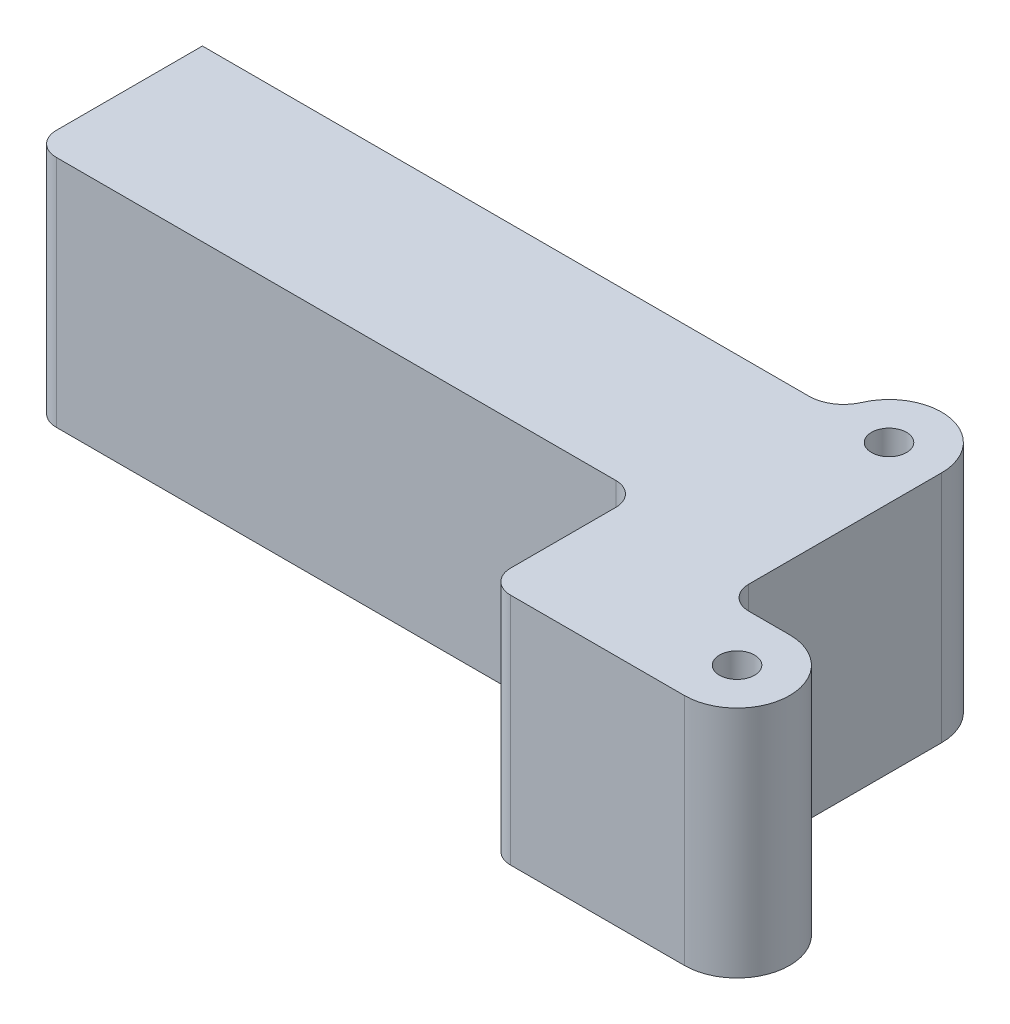
ISO-10303-21;
HEADER;
FILE_DESCRIPTION(('STEP AP214'),'2;1');
FILE_NAME('part.step','',(''),(''),'','','');
FILE_SCHEMA(('AUTOMOTIVE_DESIGN { 1 0 10303 214 1 1 1 1 }'));
ENDSEC;
DATA;
#1=APPLICATION_CONTEXT('core data for automotive mechanical design processes');
#2=APPLICATION_PROTOCOL_DEFINITION('international standard','automotive_design',2000,#1);
#3=PRODUCT_CONTEXT('',#1,'mechanical');
#4=PRODUCT('Part','Part','',(#3));
#5=PRODUCT_RELATED_PRODUCT_CATEGORY('part','',(#4));
#6=PRODUCT_DEFINITION_FORMATION('','',#4);
#7=PRODUCT_DEFINITION_CONTEXT('part definition',#1,'design');
#8=PRODUCT_DEFINITION('design','',#6,#7);
#9=PRODUCT_DEFINITION_SHAPE('','',#8);
#10=(LENGTH_UNIT() NAMED_UNIT(*) SI_UNIT(.MILLI.,.METRE.));
#11=(NAMED_UNIT(*) PLANE_ANGLE_UNIT() SI_UNIT($,.RADIAN.));
#12=(NAMED_UNIT(*) SI_UNIT($,.STERADIAN.) SOLID_ANGLE_UNIT());
#13=UNCERTAINTY_MEASURE_WITH_UNIT(LENGTH_MEASURE(1.E-05),#10,'distance_accuracy_value','');
#14=(GEOMETRIC_REPRESENTATION_CONTEXT(3) GLOBAL_UNCERTAINTY_ASSIGNED_CONTEXT((#13)) GLOBAL_UNIT_ASSIGNED_CONTEXT((#10,
#11,#12)) REPRESENTATION_CONTEXT('',''));
#15=CARTESIAN_POINT('',(0.,0.,0.));
#16=DIRECTION('',(0.,0.,1.));
#17=DIRECTION('',(1.,0.,0.));
#18=AXIS2_PLACEMENT_3D('',#15,#16,#17);
#19=CARTESIAN_POINT('',(-36.7213114754099,-12.2950819672131,5.));
#20=DIRECTION('',(0.,1.,0.));
#21=DIRECTION('',(0.,0.,1.));
#22=AXIS2_PLACEMENT_3D('',#19,#20,#21);
#23=PLANE('',#22);
#24=DIRECTION('',(0.,0.,-1.));
#25=VECTOR('',#24,1.);
#26=CARTESIAN_POINT('',(-29.9559446106797,-12.2950819672131,-0.980668059723612));
#27=LINE('',#26,#25);
#28=CARTESIAN_POINT('',(-29.9559446106797,-12.2950819672131,3.));
#29=VERTEX_POINT('',#28);
#30=CARTESIAN_POINT('',(-29.9559446106797,-12.2950819672131,-9.5));
#31=VERTEX_POINT('',#30);
#32=EDGE_CURVE('E261',#29,#31,#27,.T.);
#33=ORIENTED_EDGE('',*,*,#32,.T.);
#34=DIRECTION('',(-1.,0.,0.));
#35=VECTOR('',#34,1.);
#36=CARTESIAN_POINT('',(-29.9559446106797,-12.2950819672131,-9.5));
#37=LINE('',#36,#35);
#38=CARTESIAN_POINT('',(21.9048249821564,-12.2950819672131,-9.5));
#39=VERTEX_POINT('',#38);
#40=EDGE_CURVE('E264',#39,#31,#37,.T.);
#41=ORIENTED_EDGE('',*,*,#40,.F.);
#42=CARTESIAN_POINT('',(21.9048249821564,-12.2950819672131,-12.5));
#43=DIRECTION('',(0.,1.,0.));
#44=DIRECTION('',(0.,0.,1.));
#45=AXIS2_PLACEMENT_3D('',#42,#43,#44);
#46=CIRCLE('',#45,3.);
#47=CARTESIAN_POINT('',(24.6543703991299,-12.2950819672131,-11.3));
#48=VERTEX_POINT('',#47);
#49=EDGE_CURVE('E379',#39,#48,#46,.T.);
#50=ORIENTED_EDGE('',*,*,#49,.T.);
#51=CARTESIAN_POINT('',(28.7786885245901,-12.2950819672131,-9.5));
#52=DIRECTION('',(0.,1.,0.));
#53=DIRECTION('',(0.,0.,1.));
#54=AXIS2_PLACEMENT_3D('',#51,#52,#53);
#55=CIRCLE('',#54,4.5);
#56=CARTESIAN_POINT('',(33.2786885245902,-12.2950819672131,-9.5));
#57=VERTEX_POINT('',#56);
#58=EDGE_CURVE('E343',#57,#48,#55,.T.);
#59=ORIENTED_EDGE('',*,*,#58,.F.);
#60=DIRECTION('',(0.,0.,-1.));
#61=VECTOR('',#60,1.);
#62=CARTESIAN_POINT('',(33.2786885245902,-12.2950819672131,5.));
#63=LINE('',#62,#61);
#64=CARTESIAN_POINT('',(33.2786885245902,-12.2950819672131,7.));
#65=VERTEX_POINT('',#64);
#66=EDGE_CURVE('E367',#65,#57,#63,.T.);
#67=ORIENTED_EDGE('',*,*,#66,.F.);
#68=CARTESIAN_POINT('',(35.2786885245902,-12.2950819672131,7.));
#69=DIRECTION('',(0.,1.,0.));
#70=DIRECTION('',(0.,0.,1.));
#71=AXIS2_PLACEMENT_3D('',#68,#69,#70);
#72=CIRCLE('',#71,2.);
#73=CARTESIAN_POINT('',(35.2786885245902,-12.2950819672131,9.));
#74=VERTEX_POINT('',#73);
#75=EDGE_CURVE('E423',#65,#74,#72,.T.);
#76=ORIENTED_EDGE('',*,*,#75,.T.);
#77=DIRECTION('',(-1.,0.,0.));
#78=VECTOR('',#77,1.);
#79=CARTESIAN_POINT('',(0.,-12.2950819672131,9.));
#80=LINE('',#79,#78);
#81=CARTESIAN_POINT('',(38.7786885245901,-12.2950819672131,9.));
#82=VERTEX_POINT('',#81);
#83=EDGE_CURVE('E301',#82,#74,#80,.T.);
#84=ORIENTED_EDGE('',*,*,#83,.F.);
#85=CARTESIAN_POINT('',(38.7786885245901,-12.2950819672131,13.5));
#86=DIRECTION('',(0.,1.,0.));
#87=DIRECTION('',(0.,0.,1.));
#88=AXIS2_PLACEMENT_3D('',#85,#86,#87);
#89=CIRCLE('',#88,4.5);
#90=CARTESIAN_POINT('',(38.7786885245901,-12.2950819672131,18.));
#91=VERTEX_POINT('',#90);
#92=EDGE_CURVE('E322',#91,#82,#89,.T.);
#93=ORIENTED_EDGE('',*,*,#92,.F.);
#94=DIRECTION('',(-1.,0.,0.));
#95=VECTOR('',#94,1.);
#96=CARTESIAN_POINT('',(0.,-12.2950819672131,18.));
#97=LINE('',#96,#95);
#98=CARTESIAN_POINT('',(23.9048249821564,-12.2950819672131,18.));
#99=VERTEX_POINT('',#98);
#100=EDGE_CURVE('E313',#91,#99,#97,.T.);
#101=ORIENTED_EDGE('',*,*,#100,.T.);
#102=CARTESIAN_POINT('',(23.9048249821564,-12.2950819672131,16.));
#103=DIRECTION('',(0.,1.,0.));
#104=DIRECTION('',(0.,0.,1.));
#105=AXIS2_PLACEMENT_3D('',#102,#103,#104);
#106=CIRCLE('',#105,2.);
#107=CARTESIAN_POINT('',(21.9048249821564,-12.2950819672131,16.));
#108=VERTEX_POINT('',#107);
#109=EDGE_CURVE('E413',#99,#108,#106,.F.);
#110=ORIENTED_EDGE('',*,*,#109,.T.);
#111=DIRECTION('',(0.,0.,1.));
#112=VECTOR('',#111,1.);
#113=CARTESIAN_POINT('',(21.9048249821564,-12.2950819672131,0.));
#114=LINE('',#113,#112);
#115=CARTESIAN_POINT('',(21.9048249821564,-12.2950819672131,7.));
#116=VERTEX_POINT('',#115);
#117=EDGE_CURVE('E294',#116,#108,#114,.T.);
#118=ORIENTED_EDGE('',*,*,#117,.F.);
#119=CARTESIAN_POINT('',(19.9048249821564,-12.2950819672131,7.));
#120=DIRECTION('',(0.,1.,0.));
#121=DIRECTION('',(0.,0.,1.));
#122=AXIS2_PLACEMENT_3D('',#119,#120,#121);
#123=CIRCLE('',#122,2.);
#124=CARTESIAN_POINT('',(19.9048249821564,-12.2950819672131,5.));
#125=VERTEX_POINT('',#124);
#126=EDGE_CURVE('E12',#116,#125,#123,.T.);
#127=ORIENTED_EDGE('',*,*,#126,.T.);
#128=DIRECTION('',(1.,0.,0.));
#129=VECTOR('',#128,1.);
#130=CARTESIAN_POINT('',(-36.7213114754099,-12.2950819672131,5.));
#131=LINE('',#130,#129);
#132=CARTESIAN_POINT('',(-27.9559446106797,-12.2950819672131,5.));
#133=VERTEX_POINT('',#132);
#134=EDGE_CURVE('E358',#133,#125,#131,.T.);
#135=ORIENTED_EDGE('',*,*,#134,.F.);
#136=CARTESIAN_POINT('',(-27.9559446106797,-12.2950819672131,3.));
#137=DIRECTION('',(0.,1.,0.));
#138=DIRECTION('',(0.,0.,1.));
#139=AXIS2_PLACEMENT_3D('',#136,#137,#138);
#140=CIRCLE('',#139,2.);
#141=EDGE_CURVE('E267',#133,#29,#140,.F.);
#142=ORIENTED_EDGE('',*,*,#141,.T.);
#143=EDGE_LOOP('',(#33,#41,#50,#59,#67,#76,#84,#93,#101,#110,#118,#127,#135,#142));
#144=FACE_BOUND('',#143,.T.);
#145=CARTESIAN_POINT('',(28.7786885245901,-12.2950819672131,-9.5));
#146=DIRECTION('',(0.,1.,0.));
#147=DIRECTION('',(0.,0.,1.));
#148=AXIS2_PLACEMENT_3D('',#145,#146,#147);
#149=CIRCLE('',#148,1.5);
#150=CARTESIAN_POINT('',(28.7786885245901,-12.2950819672131,-8.));
#151=VERTEX_POINT('',#150);
#152=EDGE_CURVE('E339',#151,#151,#149,.T.);
#153=ORIENTED_EDGE('',*,*,#152,.T.);
#154=EDGE_LOOP('',(#153));
#155=FACE_BOUND('',#154,.T.);
#156=CARTESIAN_POINT('',(38.7786885245901,-12.2950819672131,13.5));
#157=DIRECTION('',(0.,1.,0.));
#158=DIRECTION('',(0.,0.,1.));
#159=AXIS2_PLACEMENT_3D('',#156,#157,#158);
#160=CIRCLE('',#159,1.5);
#161=CARTESIAN_POINT('',(38.7786885245901,-12.2950819672131,15.));
#162=VERTEX_POINT('',#161);
#163=EDGE_CURVE('E325',#162,#162,#160,.T.);
#164=ORIENTED_EDGE('',*,*,#163,.T.);
#165=EDGE_LOOP('',(#164));
#166=FACE_BOUND('',#165,.T.);
#167=ADVANCED_FACE('F159',(#144,#155,#166),#23,.F.);
#168=CARTESIAN_POINT('',(-36.7213114754099,7.70491803278689,5.));
#169=DIRECTION('',(0.,-1.,0.));
#170=DIRECTION('',(0.,0.,-1.));
#171=AXIS2_PLACEMENT_3D('',#168,#169,#170);
#172=PLANE('',#171);
#173=CARTESIAN_POINT('',(28.7786885245901,7.70491803278689,-9.5));
#174=DIRECTION('',(0.,1.,0.));
#175=DIRECTION('',(0.,0.,1.));
#176=AXIS2_PLACEMENT_3D('',#173,#174,#175);
#177=CIRCLE('',#176,1.5);
#178=CARTESIAN_POINT('',(28.7786885245901,7.70491803278689,-8.));
#179=VERTEX_POINT('',#178);
#180=EDGE_CURVE('E273',#179,#179,#177,.T.);
#181=ORIENTED_EDGE('',*,*,#180,.F.);
#182=EDGE_LOOP('',(#181));
#183=FACE_BOUND('',#182,.T.);
#184=CARTESIAN_POINT('',(38.7786885245901,7.70491803278689,13.5));
#185=DIRECTION('',(0.,1.,0.));
#186=DIRECTION('',(0.,0.,1.));
#187=AXIS2_PLACEMENT_3D('',#184,#185,#186);
#188=CIRCLE('',#187,1.5);
#189=CARTESIAN_POINT('',(38.7786885245901,7.70491803278689,15.));
#190=VERTEX_POINT('',#189);
#191=EDGE_CURVE('E326',#190,#190,#188,.T.);
#192=ORIENTED_EDGE('',*,*,#191,.F.);
#193=EDGE_LOOP('',(#192));
#194=FACE_BOUND('',#193,.T.);
#195=DIRECTION('',(-1.,0.,0.));
#196=VECTOR('',#195,1.);
#197=CARTESIAN_POINT('',(-29.9559446106797,7.70491803278689,-9.5));
#198=LINE('',#197,#196);
#199=CARTESIAN_POINT('',(21.9048249821564,7.70491803278689,-9.5));
#200=VERTEX_POINT('',#199);
#201=CARTESIAN_POINT('',(-29.9559446106797,7.70491803278689,-9.5));
#202=VERTEX_POINT('',#201);
#203=EDGE_CURVE('E284',#200,#202,#198,.T.);
#204=ORIENTED_EDGE('',*,*,#203,.T.);
#205=DIRECTION('',(0.,0.,-1.));
#206=VECTOR('',#205,1.);
#207=CARTESIAN_POINT('',(-29.9559446106797,7.70491803278689,-0.980668059723612));
#208=LINE('',#207,#206);
#209=CARTESIAN_POINT('',(-29.9559446106797,7.70491803278689,3.));
#210=VERTEX_POINT('',#209);
#211=EDGE_CURVE('E274',#210,#202,#208,.T.);
#212=ORIENTED_EDGE('',*,*,#211,.F.);
#213=CARTESIAN_POINT('',(-27.9559446106797,7.70491803278689,3.));
#214=DIRECTION('',(0.,-1.,0.));
#215=DIRECTION('',(0.,0.,-1.));
#216=AXIS2_PLACEMENT_3D('',#213,#214,#215);
#217=CIRCLE('',#216,2.);
#218=CARTESIAN_POINT('',(-27.9559446106797,7.70491803278689,5.));
#219=VERTEX_POINT('',#218);
#220=EDGE_CURVE('E385',#210,#219,#217,.F.);
#221=ORIENTED_EDGE('',*,*,#220,.T.);
#222=DIRECTION('',(-1.,0.,0.));
#223=VECTOR('',#222,1.);
#224=CARTESIAN_POINT('',(-36.7213114754099,7.70491803278689,5.));
#225=LINE('',#224,#223);
#226=CARTESIAN_POINT('',(19.9048249821564,7.70491803278689,5.));
#227=VERTEX_POINT('',#226);
#228=EDGE_CURVE('E361',#227,#219,#225,.T.);
#229=ORIENTED_EDGE('',*,*,#228,.F.);
#230=CARTESIAN_POINT('',(19.9048249821564,7.70491803278689,7.));
#231=DIRECTION('',(0.,-1.,0.));
#232=DIRECTION('',(0.,0.,-1.));
#233=AXIS2_PLACEMENT_3D('',#230,#231,#232);
#234=CIRCLE('',#233,2.);
#235=CARTESIAN_POINT('',(21.9048249821564,7.70491803278689,7.));
#236=VERTEX_POINT('',#235);
#237=EDGE_CURVE('E168',#227,#236,#234,.T.);
#238=ORIENTED_EDGE('',*,*,#237,.T.);
#239=DIRECTION('',(0.,0.,1.));
#240=VECTOR('',#239,1.);
#241=CARTESIAN_POINT('',(21.9048249821564,7.70491803278689,0.));
#242=LINE('',#241,#240);
#243=CARTESIAN_POINT('',(21.9048249821564,7.70491803278689,16.));
#244=VERTEX_POINT('',#243);
#245=EDGE_CURVE('E290',#236,#244,#242,.T.);
#246=ORIENTED_EDGE('',*,*,#245,.T.);
#247=CARTESIAN_POINT('',(23.9048249821564,7.70491803278689,16.));
#248=DIRECTION('',(0.,-1.,0.));
#249=DIRECTION('',(0.,0.,-1.));
#250=AXIS2_PLACEMENT_3D('',#247,#248,#249);
#251=CIRCLE('',#250,2.);
#252=CARTESIAN_POINT('',(23.9048249821564,7.70491803278689,18.));
#253=VERTEX_POINT('',#252);
#254=EDGE_CURVE('E408',#244,#253,#251,.F.);
#255=ORIENTED_EDGE('',*,*,#254,.T.);
#256=DIRECTION('',(-1.,0.,0.));
#257=VECTOR('',#256,1.);
#258=CARTESIAN_POINT('',(0.,7.70491803278689,18.));
#259=LINE('',#258,#257);
#260=CARTESIAN_POINT('',(38.7786885245901,7.70491803278689,18.));
#261=VERTEX_POINT('',#260);
#262=EDGE_CURVE('E312',#261,#253,#259,.T.);
#263=ORIENTED_EDGE('',*,*,#262,.F.);
#264=CARTESIAN_POINT('',(38.7786885245901,7.70491803278689,13.5));
#265=DIRECTION('',(0.,1.,0.));
#266=DIRECTION('',(0.,0.,1.));
#267=AXIS2_PLACEMENT_3D('',#264,#265,#266);
#268=CIRCLE('',#267,4.5);
#269=CARTESIAN_POINT('',(38.7786885245901,7.70491803278689,9.));
#270=VERTEX_POINT('',#269);
#271=EDGE_CURVE('E321',#261,#270,#268,.T.);
#272=ORIENTED_EDGE('',*,*,#271,.T.);
#273=DIRECTION('',(-1.,0.,0.));
#274=VECTOR('',#273,1.);
#275=CARTESIAN_POINT('',(0.,7.70491803278689,9.));
#276=LINE('',#275,#274);
#277=CARTESIAN_POINT('',(35.2786885245902,7.70491803278689,9.));
#278=VERTEX_POINT('',#277);
#279=EDGE_CURVE('E299',#270,#278,#276,.T.);
#280=ORIENTED_EDGE('',*,*,#279,.T.);
#281=CARTESIAN_POINT('',(35.2786885245902,7.70491803278689,7.));
#282=DIRECTION('',(0.,-1.,0.));
#283=DIRECTION('',(0.,0.,-1.));
#284=AXIS2_PLACEMENT_3D('',#281,#282,#283);
#285=CIRCLE('',#284,2.);
#286=CARTESIAN_POINT('',(33.2786885245902,7.70491803278689,7.));
#287=VERTEX_POINT('',#286);
#288=EDGE_CURVE('E420',#278,#287,#285,.T.);
#289=ORIENTED_EDGE('',*,*,#288,.T.);
#290=DIRECTION('',(0.,0.,-1.));
#291=VECTOR('',#290,1.);
#292=CARTESIAN_POINT('',(33.2786885245902,7.70491803278689,5.));
#293=LINE('',#292,#291);
#294=CARTESIAN_POINT('',(33.2786885245902,7.70491803278689,-9.5));
#295=VERTEX_POINT('',#294);
#296=EDGE_CURVE('E364',#287,#295,#293,.T.);
#297=ORIENTED_EDGE('',*,*,#296,.T.);
#298=CARTESIAN_POINT('',(28.7786885245901,7.70491803278689,-9.5));
#299=DIRECTION('',(0.,1.,0.));
#300=DIRECTION('',(0.,0.,1.));
#301=AXIS2_PLACEMENT_3D('',#298,#299,#300);
#302=CIRCLE('',#301,4.5);
#303=CARTESIAN_POINT('',(24.6543703991299,7.70491803278689,-11.3));
#304=VERTEX_POINT('',#303);
#305=EDGE_CURVE('E344',#295,#304,#302,.T.);
#306=ORIENTED_EDGE('',*,*,#305,.T.);
#307=CARTESIAN_POINT('',(21.9048249821564,7.70491803278689,-12.5));
#308=DIRECTION('',(0.,-1.,0.));
#309=DIRECTION('',(0.,0.,-1.));
#310=AXIS2_PLACEMENT_3D('',#307,#308,#309);
#311=CIRCLE('',#310,3.);
#312=EDGE_CURVE('E376',#304,#200,#311,.T.);
#313=ORIENTED_EDGE('',*,*,#312,.T.);
#314=EDGE_LOOP('',(#204,#212,#221,#229,#238,#246,#255,#263,#272,#280,#289,#297,#306,#313));
#315=FACE_BOUND('',#314,.T.);
#316=ADVANCED_FACE('F429',(#183,#194,#315),#172,.F.);
#317=CARTESIAN_POINT('',(0.,-12.2950819672131,18.));
#318=DIRECTION('',(0.,0.,-1.));
#319=DIRECTION('',(-1.,0.,0.));
#320=AXIS2_PLACEMENT_3D('',#317,#318,#319);
#321=PLANE('',#320);
#322=ORIENTED_EDGE('',*,*,#262,.T.);
#323=DIRECTION('',(0.,1.,0.));
#324=VECTOR('',#323,1.);
#325=CARTESIAN_POINT('',(23.9048249821564,-12.2950819672131,18.));
#326=LINE('',#325,#324);
#327=EDGE_CURVE('E181',#253,#99,#326,.F.);
#328=ORIENTED_EDGE('',*,*,#327,.T.);
#329=ORIENTED_EDGE('',*,*,#100,.F.);
#330=DIRECTION('',(0.,1.,0.));
#331=VECTOR('',#330,1.);
#332=CARTESIAN_POINT('',(38.7786885245901,-12.2950819672131,18.));
#333=LINE('',#332,#331);
#334=EDGE_CURVE('E316',#91,#261,#333,.T.);
#335=ORIENTED_EDGE('',*,*,#334,.T.);
#336=EDGE_LOOP('',(#322,#328,#329,#335));
#337=FACE_BOUND('',#336,.T.);
#338=ADVANCED_FACE('F472',(#337),#321,.F.);
#339=CARTESIAN_POINT('',(0.,0.,5.));
#340=DIRECTION('',(0.,0.,1.));
#341=DIRECTION('',(1.,0.,0.));
#342=AXIS2_PLACEMENT_3D('',#339,#340,#341);
#343=PLANE('',#342);
#344=ORIENTED_EDGE('',*,*,#134,.T.);
#345=DIRECTION('',(0.,1.,0.));
#346=VECTOR('',#345,1.);
#347=CARTESIAN_POINT('',(19.9048249821564,7.70491803278689,5.));
#348=LINE('',#347,#346);
#349=EDGE_CURVE('E416',#125,#227,#348,.T.);
#350=ORIENTED_EDGE('',*,*,#349,.T.);
#351=ORIENTED_EDGE('',*,*,#228,.T.);
#352=DIRECTION('',(0.,1.,0.));
#353=VECTOR('',#352,1.);
#354=CARTESIAN_POINT('',(-27.9559446106797,-12.2950819672131,5.));
#355=LINE('',#354,#353);
#356=EDGE_CURVE('E389',#219,#133,#355,.F.);
#357=ORIENTED_EDGE('',*,*,#356,.T.);
#358=EDGE_LOOP('',(#344,#350,#351,#357));
#359=FACE_BOUND('',#358,.T.);
#360=ADVANCED_FACE('F437',(#359),#343,.T.);
#361=CARTESIAN_POINT('',(38.7786885245901,-12.2950819672131,13.5));
#362=DIRECTION('',(0.,1.,0.));
#363=DIRECTION('',(0.,0.,1.));
#364=AXIS2_PLACEMENT_3D('',#361,#362,#363);
#365=CYLINDRICAL_SURFACE('',#364,4.5);
#366=ORIENTED_EDGE('',*,*,#271,.F.);
#367=ORIENTED_EDGE('',*,*,#334,.F.);
#368=ORIENTED_EDGE('',*,*,#92,.T.);
#369=DIRECTION('',(0.,1.,0.));
#370=VECTOR('',#369,1.);
#371=CARTESIAN_POINT('',(38.7786885245901,-12.2950819672131,9.));
#372=LINE('',#371,#370);
#373=EDGE_CURVE('E305',#82,#270,#372,.T.);
#374=ORIENTED_EDGE('',*,*,#373,.T.);
#375=EDGE_LOOP('',(#366,#367,#368,#374));
#376=FACE_BOUND('',#375,.T.);
#377=ADVANCED_FACE('F467',(#376),#365,.T.);
#378=CARTESIAN_POINT('',(33.2786885245902,7.70491803278689,5.));
#379=DIRECTION('',(-1.,0.,0.));
#380=DIRECTION('',(0.,0.,1.));
#381=AXIS2_PLACEMENT_3D('',#378,#379,#380);
#382=PLANE('',#381);
#383=ORIENTED_EDGE('',*,*,#296,.F.);
#384=DIRECTION('',(0.,1.,0.));
#385=VECTOR('',#384,1.);
#386=CARTESIAN_POINT('',(33.2786885245902,7.70491803278689,7.));
#387=LINE('',#386,#385);
#388=EDGE_CURVE('E398',#287,#65,#387,.F.);
#389=ORIENTED_EDGE('',*,*,#388,.T.);
#390=ORIENTED_EDGE('',*,*,#66,.T.);
#391=DIRECTION('',(0.,1.,0.));
#392=VECTOR('',#391,1.);
#393=CARTESIAN_POINT('',(33.2786885245902,-12.2950819672131,-9.5));
#394=LINE('',#393,#392);
#395=EDGE_CURVE('E348',#57,#295,#394,.T.);
#396=ORIENTED_EDGE('',*,*,#395,.T.);
#397=EDGE_LOOP('',(#383,#389,#390,#396));
#398=FACE_BOUND('',#397,.T.);
#399=ADVANCED_FACE('F452',(#398),#382,.F.);
#400=CARTESIAN_POINT('',(28.7786885245901,-12.2950819672131,-9.5));
#401=DIRECTION('',(0.,1.,0.));
#402=DIRECTION('',(0.,0.,1.));
#403=AXIS2_PLACEMENT_3D('',#400,#401,#402);
#404=CYLINDRICAL_SURFACE('',#403,4.5);
#405=ORIENTED_EDGE('',*,*,#58,.T.);
#406=DIRECTION('',(0.,1.,0.));
#407=VECTOR('',#406,1.);
#408=CARTESIAN_POINT('',(24.6543703991299,-12.2950819672131,-11.3));
#409=LINE('',#408,#407);
#410=EDGE_CURVE('E370',#48,#304,#409,.T.);
#411=ORIENTED_EDGE('',*,*,#410,.T.);
#412=ORIENTED_EDGE('',*,*,#305,.F.);
#413=ORIENTED_EDGE('',*,*,#395,.F.);
#414=EDGE_LOOP('',(#405,#411,#412,#413));
#415=FACE_BOUND('',#414,.T.);
#416=ADVANCED_FACE('F448',(#415),#404,.T.);
#417=CARTESIAN_POINT('',(28.7786885245901,-12.2950819672131,-9.5));
#418=DIRECTION('',(0.,1.,0.));
#419=DIRECTION('',(0.,0.,1.));
#420=AXIS2_PLACEMENT_3D('',#417,#418,#419);
#421=CYLINDRICAL_SURFACE('',#420,1.5);
#422=ORIENTED_EDGE('',*,*,#152,.F.);
#423=EDGE_LOOP('',(#422));
#424=FACE_BOUND('',#423,.T.);
#425=ORIENTED_EDGE('',*,*,#180,.T.);
#426=EDGE_LOOP('',(#425));
#427=FACE_BOUND('',#426,.T.);
#428=ADVANCED_FACE('F528',(#424,#427),#421,.F.);
#429=CARTESIAN_POINT('',(-29.9559446106797,-12.2950819672131,-0.980668059723612));
#430=DIRECTION('',(1.,0.,0.));
#431=DIRECTION('',(0.,0.,-1.));
#432=AXIS2_PLACEMENT_3D('',#429,#430,#431);
#433=PLANE('',#432);
#434=ORIENTED_EDGE('',*,*,#32,.F.);
#435=DIRECTION('',(0.,1.,0.));
#436=VECTOR('',#435,1.);
#437=CARTESIAN_POINT('',(-29.9559446106797,7.70491803278689,3.));
#438=LINE('',#437,#436);
#439=EDGE_CURVE('E382',#29,#210,#438,.T.);
#440=ORIENTED_EDGE('',*,*,#439,.T.);
#441=ORIENTED_EDGE('',*,*,#211,.T.);
#442=DIRECTION('',(0.,1.,0.));
#443=VECTOR('',#442,1.);
#444=CARTESIAN_POINT('',(-29.9559446106797,-12.2950819672131,-9.5));
#445=LINE('',#444,#443);
#446=EDGE_CURVE('E280',#31,#202,#445,.T.);
#447=ORIENTED_EDGE('',*,*,#446,.F.);
#448=EDGE_LOOP('',(#434,#440,#441,#447));
#449=FACE_BOUND('',#448,.T.);
#450=ADVANCED_FACE('F287',(#449),#433,.F.);
#451=CARTESIAN_POINT('',(-29.9559446106797,-12.2950819672131,-9.5));
#452=DIRECTION('',(0.,0.,-1.));
#453=DIRECTION('',(-1.,0.,0.));
#454=AXIS2_PLACEMENT_3D('',#451,#452,#453);
#455=PLANE('',#454);
#456=ORIENTED_EDGE('',*,*,#40,.T.);
#457=ORIENTED_EDGE('',*,*,#446,.T.);
#458=ORIENTED_EDGE('',*,*,#203,.F.);
#459=DIRECTION('',(0.,-1.,0.));
#460=VECTOR('',#459,1.);
#461=CARTESIAN_POINT('',(21.9048249821564,-12.2950819672131,-9.5));
#462=LINE('',#461,#460);
#463=EDGE_CURVE('E282',#200,#39,#462,.T.);
#464=ORIENTED_EDGE('',*,*,#463,.T.);
#465=EDGE_LOOP('',(#456,#457,#458,#464));
#466=FACE_BOUND('',#465,.T.);
#467=ADVANCED_FACE('F278',(#466),#455,.T.);
#468=CARTESIAN_POINT('',(21.9048249821564,-12.2950819672131,-12.5));
#469=DIRECTION('',(0.,1.,0.));
#470=DIRECTION('',(0.,0.,1.));
#471=AXIS2_PLACEMENT_3D('',#468,#469,#470);
#472=CYLINDRICAL_SURFACE('',#471,3.);
#473=ORIENTED_EDGE('',*,*,#49,.F.);
#474=ORIENTED_EDGE('',*,*,#463,.F.);
#475=ORIENTED_EDGE('',*,*,#312,.F.);
#476=ORIENTED_EDGE('',*,*,#410,.F.);
#477=EDGE_LOOP('',(#473,#474,#475,#476));
#478=FACE_BOUND('',#477,.T.);
#479=ADVANCED_FACE('F442',(#478),#472,.F.);
#480=CARTESIAN_POINT('',(-27.9559446106797,-12.2950819672131,3.));
#481=DIRECTION('',(0.,-1.,0.));
#482=DIRECTION('',(0.,0.,-1.));
#483=AXIS2_PLACEMENT_3D('',#480,#481,#482);
#484=CYLINDRICAL_SURFACE('',#483,2.);
#485=ORIENTED_EDGE('',*,*,#141,.F.);
#486=ORIENTED_EDGE('',*,*,#356,.F.);
#487=ORIENTED_EDGE('',*,*,#220,.F.);
#488=ORIENTED_EDGE('',*,*,#439,.F.);
#489=EDGE_LOOP('',(#485,#486,#487,#488));
#490=FACE_BOUND('',#489,.T.);
#491=ADVANCED_FACE('F440',(#490),#484,.T.);
#492=CARTESIAN_POINT('',(38.7786885245901,-12.2950819672131,13.5));
#493=DIRECTION('',(0.,1.,0.));
#494=DIRECTION('',(0.,0.,1.));
#495=AXIS2_PLACEMENT_3D('',#492,#493,#494);
#496=CYLINDRICAL_SURFACE('',#495,1.5);
#497=ORIENTED_EDGE('',*,*,#163,.F.);
#498=EDGE_LOOP('',(#497));
#499=FACE_BOUND('',#498,.T.);
#500=ORIENTED_EDGE('',*,*,#191,.T.);
#501=EDGE_LOOP('',(#500));
#502=FACE_BOUND('',#501,.T.);
#503=ADVANCED_FACE('F496',(#499,#502),#496,.F.);
#504=CARTESIAN_POINT('',(0.,-12.2950819672131,9.));
#505=DIRECTION('',(0.,0.,-1.));
#506=DIRECTION('',(-1.,0.,0.));
#507=AXIS2_PLACEMENT_3D('',#504,#505,#506);
#508=PLANE('',#507);
#509=ORIENTED_EDGE('',*,*,#83,.T.);
#510=DIRECTION('',(0.,1.,0.));
#511=VECTOR('',#510,1.);
#512=CARTESIAN_POINT('',(35.2786885245902,-12.2950819672131,9.));
#513=LINE('',#512,#511);
#514=EDGE_CURVE('E394',#74,#278,#513,.T.);
#515=ORIENTED_EDGE('',*,*,#514,.T.);
#516=ORIENTED_EDGE('',*,*,#279,.F.);
#517=ORIENTED_EDGE('',*,*,#373,.F.);
#518=EDGE_LOOP('',(#509,#515,#516,#517));
#519=FACE_BOUND('',#518,.T.);
#520=ADVANCED_FACE('F461',(#519),#508,.T.);
#521=CARTESIAN_POINT('',(21.9048249821564,-12.2950819672131,0.));
#522=DIRECTION('',(-1.,0.,0.));
#523=DIRECTION('',(0.,0.,1.));
#524=AXIS2_PLACEMENT_3D('',#521,#522,#523);
#525=PLANE('',#524);
#526=ORIENTED_EDGE('',*,*,#117,.T.);
#527=DIRECTION('',(0.,1.,0.));
#528=VECTOR('',#527,1.);
#529=CARTESIAN_POINT('',(21.9048249821564,7.70491803278689,16.));
#530=LINE('',#529,#528);
#531=EDGE_CURVE('E404',#108,#244,#530,.T.);
#532=ORIENTED_EDGE('',*,*,#531,.T.);
#533=ORIENTED_EDGE('',*,*,#245,.F.);
#534=DIRECTION('',(0.,1.,0.));
#535=VECTOR('',#534,1.);
#536=CARTESIAN_POINT('',(21.9048249821564,-12.2950819672131,7.));
#537=LINE('',#536,#535);
#538=EDGE_CURVE('E401',#236,#116,#537,.F.);
#539=ORIENTED_EDGE('',*,*,#538,.T.);
#540=EDGE_LOOP('',(#526,#532,#533,#539));
#541=FACE_BOUND('',#540,.T.);
#542=ADVANCED_FACE('F434',(#541),#525,.T.);
#543=CARTESIAN_POINT('',(35.2786885245902,-12.2950819672131,7.));
#544=DIRECTION('',(0.,1.,0.));
#545=DIRECTION('',(0.,0.,1.));
#546=AXIS2_PLACEMENT_3D('',#543,#544,#545);
#547=CYLINDRICAL_SURFACE('',#546,2.);
#548=ORIENTED_EDGE('',*,*,#75,.F.);
#549=ORIENTED_EDGE('',*,*,#388,.F.);
#550=ORIENTED_EDGE('',*,*,#288,.F.);
#551=ORIENTED_EDGE('',*,*,#514,.F.);
#552=EDGE_LOOP('',(#548,#549,#550,#551));
#553=FACE_BOUND('',#552,.T.);
#554=ADVANCED_FACE('F458',(#553),#547,.F.);
#555=CARTESIAN_POINT('',(23.9048249821564,-12.2950819672131,16.));
#556=DIRECTION('',(0.,-1.,0.));
#557=DIRECTION('',(0.,0.,-1.));
#558=AXIS2_PLACEMENT_3D('',#555,#556,#557);
#559=CYLINDRICAL_SURFACE('',#558,2.);
#560=ORIENTED_EDGE('',*,*,#109,.F.);
#561=ORIENTED_EDGE('',*,*,#327,.F.);
#562=ORIENTED_EDGE('',*,*,#254,.F.);
#563=ORIENTED_EDGE('',*,*,#531,.F.);
#564=EDGE_LOOP('',(#560,#561,#562,#563));
#565=FACE_BOUND('',#564,.T.);
#566=ADVANCED_FACE('F471',(#565),#559,.T.);
#567=CARTESIAN_POINT('',(19.9048249821564,0.,7.));
#568=DIRECTION('',(0.,-1.,0.));
#569=DIRECTION('',(0.,0.,-1.));
#570=AXIS2_PLACEMENT_3D('',#567,#568,#569);
#571=CYLINDRICAL_SURFACE('',#570,2.);
#572=ORIENTED_EDGE('',*,*,#126,.F.);
#573=ORIENTED_EDGE('',*,*,#538,.F.);
#574=ORIENTED_EDGE('',*,*,#237,.F.);
#575=ORIENTED_EDGE('',*,*,#349,.F.);
#576=EDGE_LOOP('',(#572,#573,#574,#575));
#577=FACE_BOUND('',#576,.T.);
#578=ADVANCED_FACE('F161',(#577),#571,.F.);
#579=CLOSED_SHELL('',(#167,#316,#338,#360,#377,#399,#416,#428,#450,#467,#479,#491,#503,#520,
#542,#554,#566,#578));
#580=MANIFOLD_SOLID_BREP('B2',#579);
#581=ADVANCED_BREP_SHAPE_REPRESENTATION('',(#18,#580),#14);
#582=SHAPE_DEFINITION_REPRESENTATION(#9,#581);
ENDSEC;
END-ISO-10303-21;
